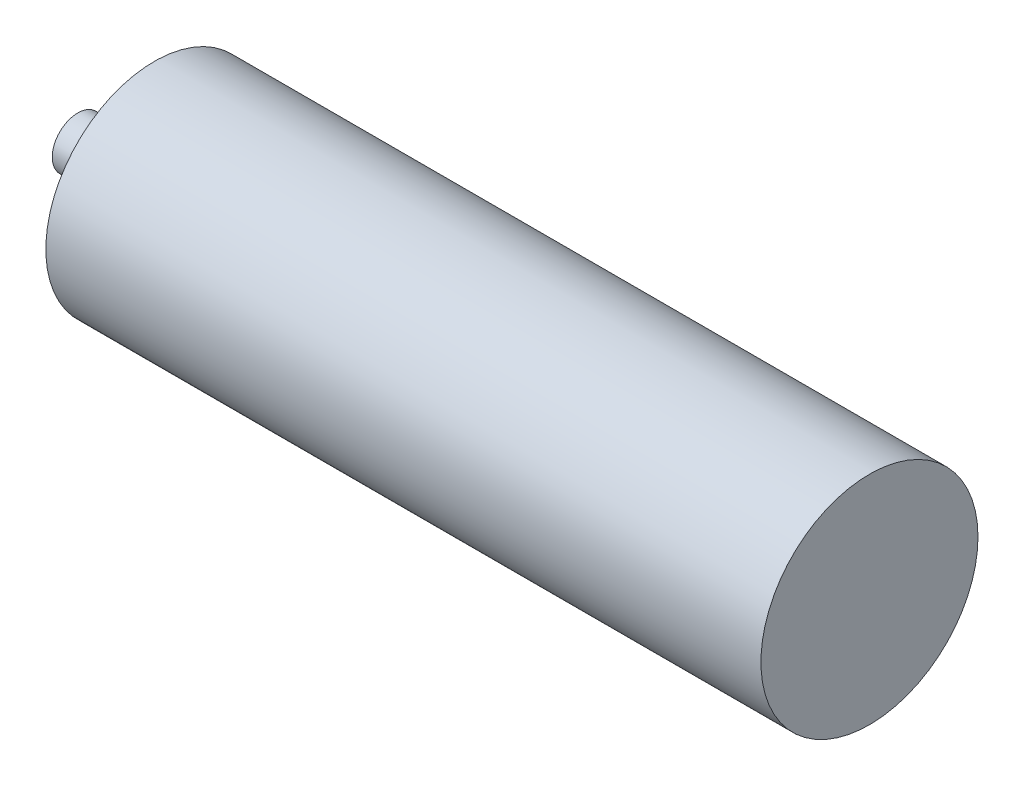
ISO-10303-21;
HEADER;
FILE_DESCRIPTION(('STEP AP214'),'2;1');
FILE_NAME('part.step','',(''),(''),'','','');
FILE_SCHEMA(('AUTOMOTIVE_DESIGN { 1 0 10303 214 1 1 1 1 }'));
ENDSEC;
DATA;
#1=APPLICATION_CONTEXT('core data for automotive mechanical design processes');
#2=APPLICATION_PROTOCOL_DEFINITION('international standard','automotive_design',2000,#1);
#3=PRODUCT_CONTEXT('',#1,'mechanical');
#4=PRODUCT('Part','Part','',(#3));
#5=PRODUCT_RELATED_PRODUCT_CATEGORY('part','',(#4));
#6=PRODUCT_DEFINITION_FORMATION('','',#4);
#7=PRODUCT_DEFINITION_CONTEXT('part definition',#1,'design');
#8=PRODUCT_DEFINITION('design','',#6,#7);
#9=PRODUCT_DEFINITION_SHAPE('','',#8);
#10=(LENGTH_UNIT() NAMED_UNIT(*) SI_UNIT(.MILLI.,.METRE.));
#11=(NAMED_UNIT(*) PLANE_ANGLE_UNIT() SI_UNIT($,.RADIAN.));
#12=(NAMED_UNIT(*) SI_UNIT($,.STERADIAN.) SOLID_ANGLE_UNIT());
#13=UNCERTAINTY_MEASURE_WITH_UNIT(LENGTH_MEASURE(1.E-05),#10,'distance_accuracy_value','');
#14=(GEOMETRIC_REPRESENTATION_CONTEXT(3) GLOBAL_UNCERTAINTY_ASSIGNED_CONTEXT((#13)) GLOBAL_UNIT_ASSIGNED_CONTEXT((#10,
#11,#12)) REPRESENTATION_CONTEXT('',''));
#15=CARTESIAN_POINT('',(0.,0.,0.));
#16=DIRECTION('',(0.,0.,1.));
#17=DIRECTION('',(1.,0.,0.));
#18=AXIS2_PLACEMENT_3D('',#15,#16,#17);
#19=CARTESIAN_POINT('',(177.8,-10.2712746451314,8.87438129339355));
#20=DIRECTION('',(-1.,0.,0.));
#21=DIRECTION('',(0.,0.,1.));
#22=AXIS2_PLACEMENT_3D('',#19,#20,#21);
#23=CYLINDRICAL_SURFACE('',#22,26.9875);
#24=CARTESIAN_POINT('',(177.8,-10.2712746451314,8.87438129339355));
#25=DIRECTION('',(1.,0.,0.));
#26=DIRECTION('',(0.,0.,-1.));
#27=AXIS2_PLACEMENT_3D('',#24,#25,#26);
#28=CIRCLE('',#27,26.9875);
#29=CARTESIAN_POINT('',(177.8,-10.2712746451314,-18.1131187066064));
#30=VERTEX_POINT('',#29);
#31=EDGE_CURVE('E51',#30,#30,#28,.T.);
#32=ORIENTED_EDGE('',*,*,#31,.F.);
#33=EDGE_LOOP('',(#32));
#34=FACE_BOUND('',#33,.T.);
#35=CARTESIAN_POINT('',(0.,-10.2712746451314,8.87438129339355));
#36=DIRECTION('',(1.,0.,0.));
#37=DIRECTION('',(0.,0.,-1.));
#38=AXIS2_PLACEMENT_3D('',#35,#36,#37);
#39=CIRCLE('',#38,26.9875);
#40=CARTESIAN_POINT('',(0.,-10.2712746451314,-18.1131187066064));
#41=VERTEX_POINT('',#40);
#42=EDGE_CURVE('E46',#41,#41,#39,.T.);
#43=ORIENTED_EDGE('',*,*,#42,.T.);
#44=EDGE_LOOP('',(#43));
#45=FACE_BOUND('',#44,.T.);
#46=ADVANCED_FACE('F43',(#34,#45),#23,.T.);
#47=CARTESIAN_POINT('',(177.8,-10.2712746451314,8.87438129339355));
#48=DIRECTION('',(1.,0.,0.));
#49=DIRECTION('',(0.,0.,-1.));
#50=AXIS2_PLACEMENT_3D('',#47,#48,#49);
#51=PLANE('',#50);
#52=ORIENTED_EDGE('',*,*,#31,.T.);
#53=EDGE_LOOP('',(#52));
#54=FACE_BOUND('',#53,.T.);
#55=ADVANCED_FACE('F71',(#54),#51,.T.);
#56=CARTESIAN_POINT('',(0.,-10.2712746451314,8.87438129339355));
#57=DIRECTION('',(1.,0.,0.));
#58=DIRECTION('',(0.,0.,-1.));
#59=AXIS2_PLACEMENT_3D('',#56,#57,#58);
#60=PLANE('',#59);
#61=CARTESIAN_POINT('',(0.,-10.2712746451314,8.87438129339355));
#62=DIRECTION('',(-1.,0.,0.));
#63=DIRECTION('',(0.,0.,1.));
#64=AXIS2_PLACEMENT_3D('',#61,#62,#63);
#65=CIRCLE('',#64,6.35);
#66=CARTESIAN_POINT('',(0.,-10.2712746451314,2.52438129339355));
#67=VERTEX_POINT('',#66);
#68=EDGE_CURVE('E10',#67,#67,#65,.T.);
#69=ORIENTED_EDGE('',*,*,#68,.F.);
#70=EDGE_LOOP('',(#69));
#71=FACE_BOUND('',#70,.T.);
#72=ORIENTED_EDGE('',*,*,#42,.F.);
#73=EDGE_LOOP('',(#72));
#74=FACE_BOUND('',#73,.T.);
#75=ADVANCED_FACE('F68',(#71,#74),#60,.F.);
#76=CARTESIAN_POINT('',(-19.05,-10.2712746451314,8.87438129339355));
#77=DIRECTION('',(1.,0.,0.));
#78=DIRECTION('',(0.,0.,-1.));
#79=AXIS2_PLACEMENT_3D('',#76,#77,#78);
#80=CYLINDRICAL_SURFACE('',#79,6.35);
#81=CARTESIAN_POINT('',(-19.05,-10.2712746451314,8.87438129339355));
#82=DIRECTION('',(-1.,0.,0.));
#83=DIRECTION('',(0.,0.,1.));
#84=AXIS2_PLACEMENT_3D('',#81,#82,#83);
#85=CIRCLE('',#84,6.35);
#86=CARTESIAN_POINT('',(-19.05,-10.2712746451314,2.52438129339355));
#87=VERTEX_POINT('',#86);
#88=EDGE_CURVE('E58',#87,#87,#85,.T.);
#89=CARTESIAN_POINT('',(-19.05,-10.2712746451314,2.52438129339355));
#90=CARTESIAN_POINT('',(-18.8515625,-10.2712746451314,2.52438129339355));
#91=CARTESIAN_POINT('',(-18.653125,-10.2712746451314,2.52438129339355));
#92=CARTESIAN_POINT('',(-18.25625,-10.2712746451314,2.52438129339355));
#93=CARTESIAN_POINT('',(-18.0578125,-10.2712746451314,2.52438129339355));
#94=CARTESIAN_POINT('',(-17.6609375,-10.2712746451314,2.52438129339355));
#95=CARTESIAN_POINT('',(-17.4625,-10.2712746451314,2.52438129339355));
#96=CARTESIAN_POINT('',(-17.065625,-10.2712746451314,2.52438129339355));
#97=CARTESIAN_POINT('',(-16.8671875,-10.2712746451314,2.52438129339355));
#98=CARTESIAN_POINT('',(-16.4703125,-10.2712746451314,2.52438129339355));
#99=CARTESIAN_POINT('',(-16.271875,-10.2712746451314,2.52438129339355));
#100=CARTESIAN_POINT('',(-15.875,-10.2712746451314,2.52438129339355));
#101=CARTESIAN_POINT('',(-15.6765625,-10.2712746451314,2.52438129339355));
#102=CARTESIAN_POINT('',(-15.2796875,-10.2712746451314,2.52438129339355));
#103=CARTESIAN_POINT('',(-15.08125,-10.2712746451314,2.52438129339355));
#104=CARTESIAN_POINT('',(-14.684375,-10.2712746451314,2.52438129339355));
#105=CARTESIAN_POINT('',(-14.4859375,-10.2712746451314,2.52438129339355));
#106=CARTESIAN_POINT('',(-14.0890625,-10.2712746451314,2.52438129339355));
#107=CARTESIAN_POINT('',(-13.890625,-10.2712746451314,2.52438129339355));
#108=CARTESIAN_POINT('',(-13.49375,-10.2712746451314,2.52438129339355));
#109=CARTESIAN_POINT('',(-13.2953125,-10.2712746451314,2.52438129339355));
#110=CARTESIAN_POINT('',(-12.8984375,-10.2712746451314,2.52438129339355));
#111=CARTESIAN_POINT('',(-12.7,-10.2712746451314,2.52438129339355));
#112=CARTESIAN_POINT('',(-12.303125,-10.2712746451314,2.52438129339355));
#113=CARTESIAN_POINT('',(-12.1046875,-10.2712746451314,2.52438129339355));
#114=CARTESIAN_POINT('',(-11.7078125,-10.2712746451314,2.52438129339355));
#115=CARTESIAN_POINT('',(-11.509375,-10.2712746451314,2.52438129339355));
#116=CARTESIAN_POINT('',(-11.1125,-10.2712746451314,2.52438129339355));
#117=CARTESIAN_POINT('',(-10.9140625,-10.2712746451314,2.52438129339355));
#118=CARTESIAN_POINT('',(-10.5171875,-10.2712746451314,2.52438129339355));
#119=CARTESIAN_POINT('',(-10.31875,-10.2712746451314,2.52438129339355));
#120=CARTESIAN_POINT('',(-9.921875,-10.2712746451314,2.52438129339355));
#121=CARTESIAN_POINT('',(-9.7234375,-10.2712746451314,2.52438129339355));
#122=CARTESIAN_POINT('',(-9.3265625,-10.2712746451314,2.52438129339355));
#123=CARTESIAN_POINT('',(-9.128125,-10.2712746451314,2.52438129339355));
#124=CARTESIAN_POINT('',(-8.73125,-10.2712746451314,2.52438129339355));
#125=CARTESIAN_POINT('',(-8.5328125,-10.2712746451314,2.52438129339355));
#126=CARTESIAN_POINT('',(-8.1359375,-10.2712746451314,2.52438129339355));
#127=CARTESIAN_POINT('',(-7.9375,-10.2712746451314,2.52438129339355));
#128=CARTESIAN_POINT('',(-7.540625,-10.2712746451314,2.52438129339355));
#129=CARTESIAN_POINT('',(-7.3421875,-10.2712746451314,2.52438129339355));
#130=CARTESIAN_POINT('',(-6.9453125,-10.2712746451314,2.52438129339355));
#131=CARTESIAN_POINT('',(-6.746875,-10.2712746451314,2.52438129339355));
#132=CARTESIAN_POINT('',(-6.35,-10.2712746451314,2.52438129339355));
#133=CARTESIAN_POINT('',(-6.1515625,-10.2712746451314,2.52438129339355));
#134=CARTESIAN_POINT('',(-5.7546875,-10.2712746451314,2.52438129339355));
#135=CARTESIAN_POINT('',(-5.55625,-10.2712746451314,2.52438129339355));
#136=CARTESIAN_POINT('',(-5.159375,-10.2712746451314,2.52438129339355));
#137=CARTESIAN_POINT('',(-4.9609375,-10.2712746451314,2.52438129339355));
#138=CARTESIAN_POINT('',(-4.5640625,-10.2712746451314,2.52438129339355));
#139=CARTESIAN_POINT('',(-4.365625,-10.2712746451314,2.52438129339355));
#140=CARTESIAN_POINT('',(-3.96875,-10.2712746451314,2.52438129339355));
#141=CARTESIAN_POINT('',(-3.7703125,-10.2712746451314,2.52438129339355));
#142=CARTESIAN_POINT('',(-3.3734375,-10.2712746451314,2.52438129339355));
#143=CARTESIAN_POINT('',(-3.175,-10.2712746451314,2.52438129339355));
#144=CARTESIAN_POINT('',(-2.778125,-10.2712746451314,2.52438129339355));
#145=CARTESIAN_POINT('',(-2.5796875,-10.2712746451314,2.52438129339355));
#146=CARTESIAN_POINT('',(-2.1828125,-10.2712746451314,2.52438129339355));
#147=CARTESIAN_POINT('',(-1.984375,-10.2712746451314,2.52438129339355));
#148=CARTESIAN_POINT('',(-1.5875,-10.2712746451314,2.52438129339355));
#149=CARTESIAN_POINT('',(-1.3890625,-10.2712746451314,2.52438129339355));
#150=CARTESIAN_POINT('',(-0.992187500000001,-10.2712746451314,2.52438129339355));
#151=CARTESIAN_POINT('',(-0.793750000000001,-10.2712746451314,2.52438129339355));
#152=CARTESIAN_POINT('',(-0.396875,-10.2712746451314,2.52438129339355));
#153=CARTESIAN_POINT('',(-0.1984375,-10.2712746451314,2.52438129339355));
#154=CARTESIAN_POINT('',(0.,-10.2712746451314,2.52438129339355));
#155=B_SPLINE_CURVE_WITH_KNOTS('',3,(#89,#90,#91,#92,#93,#94,#95,#96,#97,#98,#99,#100,#101,#102,
#103,#104,#105,#106,#107,#108,#109,#110,#111,#112,#113,#114,#115,#116,#117,#118,#119,#120,#121,
#122,#123,#124,#125,#126,#127,#128,#129,#130,#131,#132,#133,#134,#135,#136,#137,#138,#139,#140,
#141,#142,#143,#144,#145,#146,#147,#148,#149,#150,#151,#152,#153,#154),.UNSPECIFIED.,.F.,.F.,(4,
2,2,2,2,2,2,2,2,2,2,2,2,2,2,2,2,2,2,2,2,2,2,2,2,2,2,2,2,2,2,2,4),(0.,0.5953125,1.190625,
1.7859375,2.38125,2.9765625,3.571875,4.1671875,4.7625,5.3578125,5.953125,6.5484375,7.14375,
7.7390625,8.334375,8.9296875,9.525,10.1203125,10.715625,11.3109375,11.90625,12.5015625,
13.096875,13.6921875,14.2875,14.8828125,15.478125,16.0734375,16.66875,17.2640625,17.859375,
18.4546875,19.05),.UNSPECIFIED.);
#156=EDGE_CURVE('BSEAM70',#87,#67,#155,.T.);
#157=ORIENTED_EDGE('',*,*,#88,.F.);
#158=ORIENTED_EDGE('',*,*,#68,.T.);
#159=ORIENTED_EDGE('',*,*,#156,.T.);
#160=ORIENTED_EDGE('',*,*,#156,.F.);
#161=EDGE_LOOP('',(#157,#159,#158,#160));
#162=FACE_BOUND('',#161,.T.);
#163=ADVANCED_FACE('F70',(#162),#80,.T.);
#164=CARTESIAN_POINT('',(-19.05,-10.2712746451314,8.87438129339355));
#165=DIRECTION('',(-1.,0.,0.));
#166=DIRECTION('',(0.,0.,1.));
#167=AXIS2_PLACEMENT_3D('',#164,#165,#166);
#168=PLANE('',#167);
#169=ORIENTED_EDGE('',*,*,#88,.T.);
#170=EDGE_LOOP('',(#169));
#171=FACE_BOUND('',#170,.T.);
#172=ADVANCED_FACE('F77',(#171),#168,.T.);
#173=CLOSED_SHELL('',(#46,#55,#75,#163,#172));
#174=MANIFOLD_SOLID_BREP('B2',#173);
#175=ADVANCED_BREP_SHAPE_REPRESENTATION('',(#18,#174),#14);
#176=SHAPE_DEFINITION_REPRESENTATION(#9,#175);
ENDSEC;
END-ISO-10303-21;
